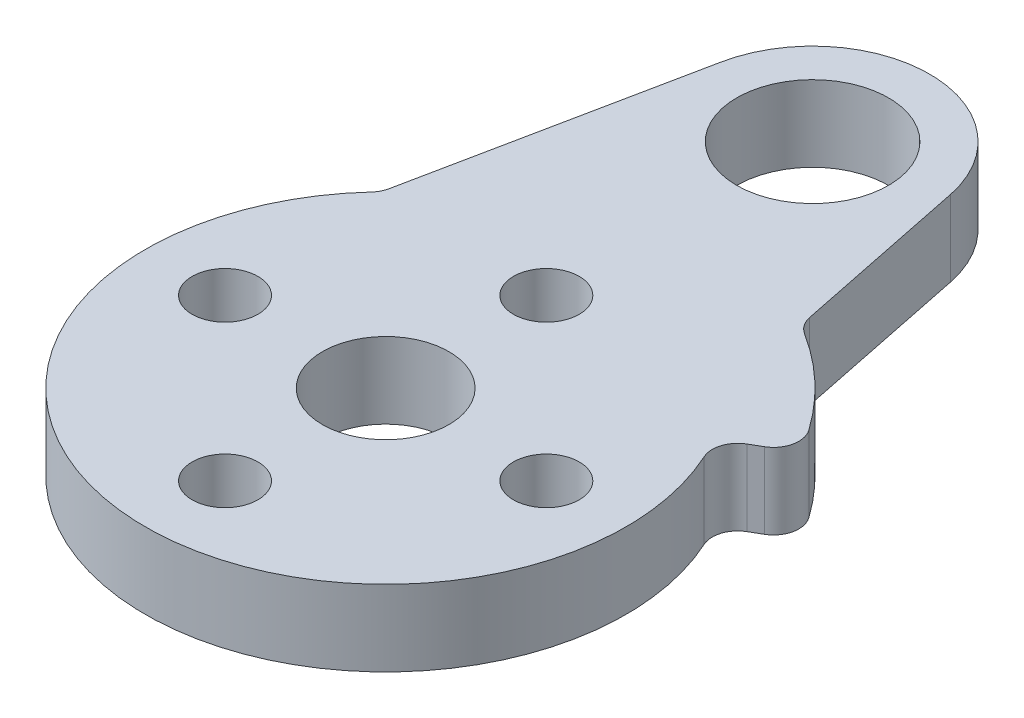
ISO-10303-21;
HEADER;
FILE_DESCRIPTION(('STEP AP214'),'2;1');
FILE_NAME('part.step','',(''),(''),'','','');
FILE_SCHEMA(('AUTOMOTIVE_DESIGN { 1 0 10303 214 1 1 1 1 }'));
ENDSEC;
DATA;
#1=APPLICATION_CONTEXT('core data for automotive mechanical design processes');
#2=APPLICATION_PROTOCOL_DEFINITION('international standard','automotive_design',2000,#1);
#3=PRODUCT_CONTEXT('',#1,'mechanical');
#4=PRODUCT('Part','Part','',(#3));
#5=PRODUCT_RELATED_PRODUCT_CATEGORY('part','',(#4));
#6=PRODUCT_DEFINITION_FORMATION('','',#4);
#7=PRODUCT_DEFINITION_CONTEXT('part definition',#1,'design');
#8=PRODUCT_DEFINITION('design','',#6,#7);
#9=PRODUCT_DEFINITION_SHAPE('','',#8);
#10=(LENGTH_UNIT() NAMED_UNIT(*) SI_UNIT(.MILLI.,.METRE.));
#11=(NAMED_UNIT(*) PLANE_ANGLE_UNIT() SI_UNIT($,.RADIAN.));
#12=(NAMED_UNIT(*) SI_UNIT($,.STERADIAN.) SOLID_ANGLE_UNIT());
#13=UNCERTAINTY_MEASURE_WITH_UNIT(LENGTH_MEASURE(1.E-05),#10,'distance_accuracy_value','');
#14=(GEOMETRIC_REPRESENTATION_CONTEXT(3) GLOBAL_UNCERTAINTY_ASSIGNED_CONTEXT((#13)) GLOBAL_UNIT_ASSIGNED_CONTEXT((#10,
#11,#12)) REPRESENTATION_CONTEXT('',''));
#15=CARTESIAN_POINT('',(0.,0.,0.));
#16=DIRECTION('',(0.,0.,1.));
#17=DIRECTION('',(1.,0.,0.));
#18=AXIS2_PLACEMENT_3D('',#15,#16,#17);
#19=CARTESIAN_POINT('',(0.,3.,-16.87456));
#20=DIRECTION('',(0.,1.,0.));
#21=DIRECTION('',(0.,0.,1.));
#22=AXIS2_PLACEMENT_3D('',#19,#20,#21);
#23=PLANE('',#22);
#24=DIRECTION('',(0.866025403784439,0.,-0.5));
#25=VECTOR('',#24,1.);
#26=CARTESIAN_POINT('',(8.22724133595217,3.,-4.75));
#27=LINE('',#26,#25);
#28=CARTESIAN_POINT('',(9.05193349511583,3.,-5.22613624009172));
#29=VERTEX_POINT('',#28);
#30=CARTESIAN_POINT('',(9.48683298050514,3.,-5.47722557505166));
#31=VERTEX_POINT('',#30);
#32=EDGE_CURVE('E192',#29,#31,#27,.T.);
#33=ORIENTED_EDGE('',*,*,#32,.T.);
#34=CARTESIAN_POINT('',(8.98683298050514,3.,-6.3432509788361));
#35=DIRECTION('',(0.,1.,0.));
#36=DIRECTION('',(0.,0.,1.));
#37=AXIS2_PLACEMENT_3D('',#34,#35,#36);
#38=CIRCLE('',#37,1.);
#39=CARTESIAN_POINT('',(9.80381779691469,3.,-6.91991015873029));
#40=VERTEX_POINT('',#39);
#41=EDGE_CURVE('E47',#31,#40,#38,.T.);
#42=ORIENTED_EDGE('',*,*,#41,.T.);
#43=CARTESIAN_POINT('',(0.,3.,0.));
#44=DIRECTION('',(0.,1.,0.));
#45=DIRECTION('',(0.,0.,1.));
#46=AXIS2_PLACEMENT_3D('',#43,#44,#45);
#47=CIRCLE('',#46,12.);
#48=CARTESIAN_POINT('',(6.40799701854467,3.,-10.1458156010408));
#49=VERTEX_POINT('',#48);
#50=EDGE_CURVE('E168',#40,#49,#47,.T.);
#51=ORIENTED_EDGE('',*,*,#50,.T.);
#52=CARTESIAN_POINT('',(6.94199677009006,3.,-10.9913002344608));
#53=DIRECTION('',(0.,1.,0.));
#54=DIRECTION('',(0.,0.,1.));
#55=AXIS2_PLACEMENT_3D('',#52,#53,#54);
#56=CIRCLE('',#55,1.);
#57=CARTESIAN_POINT('',(5.96220087297679,3.,-10.7913002344608));
#58=VERTEX_POINT('',#57);
#59=EDGE_CURVE('E164',#49,#58,#56,.F.);
#60=ORIENTED_EDGE('',*,*,#59,.T.);
#61=DIRECTION('',(-0.2,0.,-0.979795897113271));
#62=VECTOR('',#61,1.);
#63=CARTESIAN_POINT('',(4.53164224618782,3.,-17.7995776));
#64=LINE('',#63,#62);
#65=CARTESIAN_POINT('',(4.53164224618782,3.,-17.7995776));
#66=VERTEX_POINT('',#65);
#67=EDGE_CURVE('E119',#58,#66,#64,.T.);
#68=ORIENTED_EDGE('',*,*,#67,.T.);
#69=CARTESIAN_POINT('',(0.,3.,-16.87456));
#70=DIRECTION('',(0.,1.,0.));
#71=DIRECTION('',(0.,0.,1.));
#72=AXIS2_PLACEMENT_3D('',#69,#70,#71);
#73=CIRCLE('',#72,4.625088);
#74=CARTESIAN_POINT('',(-4.53164224618782,3.,-17.7995776));
#75=VERTEX_POINT('',#74);
#76=EDGE_CURVE('E120',#66,#75,#73,.T.);
#77=ORIENTED_EDGE('',*,*,#76,.T.);
#78=DIRECTION('',(-0.2,0.,0.979795897113271));
#79=VECTOR('',#78,1.);
#80=CARTESIAN_POINT('',(-4.53164224618782,3.,-17.7995776));
#81=LINE('',#80,#79);
#82=CARTESIAN_POINT('',(-6.75670179426697,3.,-6.89905651979671));
#83=VERTEX_POINT('',#82);
#84=EDGE_CURVE('E110',#75,#83,#81,.T.);
#85=ORIENTED_EDGE('',*,*,#84,.T.);
#86=CARTESIAN_POINT('',(-7.73649769138024,3.,-7.09905651979671));
#87=DIRECTION('',(0.,1.,0.));
#88=DIRECTION('',(0.,0.,1.));
#89=AXIS2_PLACEMENT_3D('',#86,#87,#88);
#90=CIRCLE('',#89,1.);
#91=CARTESIAN_POINT('',(-6.99968838743927,3.,-6.42295589886369));
#92=VERTEX_POINT('',#91);
#93=EDGE_CURVE('E158',#83,#92,#90,.F.);
#94=ORIENTED_EDGE('',*,*,#93,.T.);
#95=CARTESIAN_POINT('',(0.,3.,0.));
#96=DIRECTION('',(0.,1.,0.));
#97=DIRECTION('',(0.,0.,1.));
#98=AXIS2_PLACEMENT_3D('',#95,#96,#97);
#99=CIRCLE('',#98,9.5);
#100=CARTESIAN_POINT('',(8.64222554320004,3.,-3.9448621852304));
#101=VERTEX_POINT('',#100);
#102=EDGE_CURVE('E186',#92,#101,#99,.T.);
#103=ORIENTED_EDGE('',*,*,#102,.T.);
#104=CARTESIAN_POINT('',(9.55193349511584,3.,-4.36011083630728));
#105=DIRECTION('',(0.,1.,0.));
#106=DIRECTION('',(0.,0.,1.));
#107=AXIS2_PLACEMENT_3D('',#104,#105,#106);
#108=CIRCLE('',#107,1.);
#109=EDGE_CURVE('E40',#101,#29,#108,.F.);
#110=ORIENTED_EDGE('',*,*,#109,.T.);
#111=EDGE_LOOP('',(#33,#42,#51,#60,#68,#77,#85,#94,#103,#110));
#112=FACE_BOUND('',#111,.T.);
#113=CARTESIAN_POINT('',(0.,3.,-6.35));
#114=DIRECTION('',(0.,1.,0.));
#115=DIRECTION('',(0.,0.,1.));
#116=AXIS2_PLACEMENT_3D('',#113,#114,#115);
#117=CIRCLE('',#116,1.3);
#118=CARTESIAN_POINT('',(0.,3.,-5.05));
#119=VERTEX_POINT('',#118);
#120=EDGE_CURVE('E204',#119,#119,#117,.T.);
#121=ORIENTED_EDGE('',*,*,#120,.F.);
#122=EDGE_LOOP('',(#121));
#123=FACE_BOUND('',#122,.T.);
#124=CARTESIAN_POINT('',(6.35000000000018,3.,-1.79311378806878E-13));
#125=DIRECTION('',(0.,1.,0.));
#126=DIRECTION('',(0.,0.,1.));
#127=AXIS2_PLACEMENT_3D('',#124,#125,#126);
#128=CIRCLE('',#127,1.30000000000014);
#129=CARTESIAN_POINT('',(6.35000000000018,3.,1.29999999999996));
#130=VERTEX_POINT('',#129);
#131=EDGE_CURVE('E210',#130,#130,#128,.T.);
#132=ORIENTED_EDGE('',*,*,#131,.F.);
#133=EDGE_LOOP('',(#132));
#134=FACE_BOUND('',#133,.T.);
#135=CARTESIAN_POINT('',(3.58622757613755E-13,3.,6.35));
#136=DIRECTION('',(0.,1.,0.));
#137=DIRECTION('',(0.,0.,1.));
#138=AXIS2_PLACEMENT_3D('',#135,#136,#137);
#139=CIRCLE('',#138,1.30000000000039);
#140=CARTESIAN_POINT('',(3.58622757613755E-13,3.,7.65000000000039));
#141=VERTEX_POINT('',#140);
#142=EDGE_CURVE('E216',#141,#141,#139,.T.);
#143=ORIENTED_EDGE('',*,*,#142,.F.);
#144=EDGE_LOOP('',(#143));
#145=FACE_BOUND('',#144,.T.);
#146=CARTESIAN_POINT('',(-6.34999999999982,3.,1.80089029524336E-13));
#147=DIRECTION('',(0.,1.,0.));
#148=DIRECTION('',(0.,0.,1.));
#149=AXIS2_PLACEMENT_3D('',#146,#147,#148);
#150=CIRCLE('',#149,1.30000000000029);
#151=CARTESIAN_POINT('',(-6.34999999999982,3.,1.30000000000047));
#152=VERTEX_POINT('',#151);
#153=EDGE_CURVE('E198',#152,#152,#150,.T.);
#154=ORIENTED_EDGE('',*,*,#153,.F.);
#155=EDGE_LOOP('',(#154));
#156=FACE_BOUND('',#155,.T.);
#157=CARTESIAN_POINT('',(0.,3.,-16.87456));
#158=DIRECTION('',(0.,1.,0.));
#159=DIRECTION('',(0.,0.,1.));
#160=AXIS2_PLACEMENT_3D('',#157,#158,#159);
#161=CIRCLE('',#160,3.);
#162=CARTESIAN_POINT('',(0.,3.,-13.87456));
#163=VERTEX_POINT('',#162);
#164=EDGE_CURVE('E230',#163,#163,#161,.T.);
#165=ORIENTED_EDGE('',*,*,#164,.F.);
#166=EDGE_LOOP('',(#165));
#167=FACE_BOUND('',#166,.T.);
#168=CARTESIAN_POINT('',(0.,3.,0.));
#169=DIRECTION('',(0.,1.,0.));
#170=DIRECTION('',(0.,0.,1.));
#171=AXIS2_PLACEMENT_3D('',#168,#169,#170);
#172=CIRCLE('',#171,2.5);
#173=CARTESIAN_POINT('',(0.,3.,2.5));
#174=VERTEX_POINT('',#173);
#175=EDGE_CURVE('E224',#174,#174,#172,.T.);
#176=ORIENTED_EDGE('',*,*,#175,.F.);
#177=EDGE_LOOP('',(#176));
#178=FACE_BOUND('',#177,.T.);
#179=ADVANCED_FACE('F32',(#112,#123,#134,#145,#156,#167,#178),#23,.T.);
#180=CARTESIAN_POINT('',(0.,0.,-16.87456));
#181=DIRECTION('',(0.,1.,0.));
#182=DIRECTION('',(0.,0.,1.));
#183=AXIS2_PLACEMENT_3D('',#180,#181,#182);
#184=PLANE('',#183);
#185=CARTESIAN_POINT('',(0.,0.,0.));
#186=DIRECTION('',(0.,1.,0.));
#187=DIRECTION('',(0.,0.,1.));
#188=AXIS2_PLACEMENT_3D('',#185,#186,#187);
#189=CIRCLE('',#188,12.);
#190=CARTESIAN_POINT('',(6.40799701854467,0.,-10.1458156010408));
#191=VERTEX_POINT('',#190);
#192=CARTESIAN_POINT('',(9.80381779691469,0.,-6.91991015873029));
#193=VERTEX_POINT('',#192);
#194=EDGE_CURVE('E182',#191,#193,#189,.F.);
#195=ORIENTED_EDGE('',*,*,#194,.T.);
#196=CARTESIAN_POINT('',(8.98683298050514,0.,-6.3432509788361));
#197=DIRECTION('',(0.,1.,0.));
#198=DIRECTION('',(0.,0.,1.));
#199=AXIS2_PLACEMENT_3D('',#196,#197,#198);
#200=CIRCLE('',#199,1.);
#201=CARTESIAN_POINT('',(9.48683298050514,0.,-5.47722557505166));
#202=VERTEX_POINT('',#201);
#203=EDGE_CURVE('E156',#193,#202,#200,.F.);
#204=ORIENTED_EDGE('',*,*,#203,.T.);
#205=DIRECTION('',(-0.866025403784439,0.,0.5));
#206=VECTOR('',#205,1.);
#207=CARTESIAN_POINT('',(8.22724133595217,0.,-4.75));
#208=LINE('',#207,#206);
#209=CARTESIAN_POINT('',(9.05193349511583,0.,-5.22613624009172));
#210=VERTEX_POINT('',#209);
#211=EDGE_CURVE('E187',#202,#210,#208,.T.);
#212=ORIENTED_EDGE('',*,*,#211,.T.);
#213=CARTESIAN_POINT('',(9.55193349511584,0.,-4.36011083630728));
#214=DIRECTION('',(0.,1.,0.));
#215=DIRECTION('',(0.,0.,1.));
#216=AXIS2_PLACEMENT_3D('',#213,#214,#215);
#217=CIRCLE('',#216,1.);
#218=CARTESIAN_POINT('',(8.64222554320004,0.,-3.9448621852304));
#219=VERTEX_POINT('',#218);
#220=EDGE_CURVE('E11',#210,#219,#217,.T.);
#221=ORIENTED_EDGE('',*,*,#220,.T.);
#222=CARTESIAN_POINT('',(0.,0.,0.));
#223=DIRECTION('',(0.,1.,0.));
#224=DIRECTION('',(0.,0.,1.));
#225=AXIS2_PLACEMENT_3D('',#222,#223,#224);
#226=CIRCLE('',#225,9.5);
#227=CARTESIAN_POINT('',(-6.99968838743927,0.,-6.42295589886369));
#228=VERTEX_POINT('',#227);
#229=EDGE_CURVE('E189',#228,#219,#226,.T.);
#230=ORIENTED_EDGE('',*,*,#229,.F.);
#231=CARTESIAN_POINT('',(-7.73649769138024,0.,-7.09905651979671));
#232=DIRECTION('',(0.,1.,0.));
#233=DIRECTION('',(0.,0.,1.));
#234=AXIS2_PLACEMENT_3D('',#231,#232,#233);
#235=CIRCLE('',#234,1.);
#236=CARTESIAN_POINT('',(-6.75670179426697,0.,-6.89905651979671));
#237=VERTEX_POINT('',#236);
#238=EDGE_CURVE('E160',#228,#237,#235,.T.);
#239=ORIENTED_EDGE('',*,*,#238,.T.);
#240=DIRECTION('',(-0.2,0.,0.979795897113271));
#241=VECTOR('',#240,1.);
#242=CARTESIAN_POINT('',(-4.53164224618782,0.,-17.7995776));
#243=LINE('',#242,#241);
#244=CARTESIAN_POINT('',(-4.53164224618782,0.,-17.7995776));
#245=VERTEX_POINT('',#244);
#246=EDGE_CURVE('E236',#245,#237,#243,.T.);
#247=ORIENTED_EDGE('',*,*,#246,.F.);
#248=CARTESIAN_POINT('',(0.,0.,-16.87456));
#249=DIRECTION('',(0.,1.,0.));
#250=DIRECTION('',(0.,0.,1.));
#251=AXIS2_PLACEMENT_3D('',#248,#249,#250);
#252=CIRCLE('',#251,4.625088);
#253=CARTESIAN_POINT('',(4.53164224618782,0.,-17.7995776));
#254=VERTEX_POINT('',#253);
#255=EDGE_CURVE('E132',#254,#245,#252,.T.);
#256=ORIENTED_EDGE('',*,*,#255,.F.);
#257=DIRECTION('',(-0.2,0.,-0.979795897113271));
#258=VECTOR('',#257,1.);
#259=CARTESIAN_POINT('',(4.53164224618782,0.,-17.7995776));
#260=LINE('',#259,#258);
#261=CARTESIAN_POINT('',(5.96220087297679,0.,-10.7913002344608));
#262=VERTEX_POINT('',#261);
#263=EDGE_CURVE('E128',#262,#254,#260,.T.);
#264=ORIENTED_EDGE('',*,*,#263,.F.);
#265=CARTESIAN_POINT('',(6.94199677009006,0.,-10.9913002344608));
#266=DIRECTION('',(0.,1.,0.));
#267=DIRECTION('',(0.,0.,1.));
#268=AXIS2_PLACEMENT_3D('',#265,#266,#267);
#269=CIRCLE('',#268,1.);
#270=EDGE_CURVE('E162',#262,#191,#269,.T.);
#271=ORIENTED_EDGE('',*,*,#270,.T.);
#272=EDGE_LOOP('',(#195,#204,#212,#221,#230,#239,#247,#256,#264,#271));
#273=FACE_BOUND('',#272,.T.);
#274=CARTESIAN_POINT('',(0.,0.,-6.35));
#275=DIRECTION('',(0.,1.,0.));
#276=DIRECTION('',(0.,0.,1.));
#277=AXIS2_PLACEMENT_3D('',#274,#275,#276);
#278=CIRCLE('',#277,1.3);
#279=CARTESIAN_POINT('',(0.,0.,-5.05));
#280=VERTEX_POINT('',#279);
#281=EDGE_CURVE('E200',#280,#280,#278,.T.);
#282=ORIENTED_EDGE('',*,*,#281,.T.);
#283=EDGE_LOOP('',(#282));
#284=FACE_BOUND('',#283,.T.);
#285=CARTESIAN_POINT('',(6.35000000000018,0.,-1.79311378806878E-13));
#286=DIRECTION('',(0.,1.,0.));
#287=DIRECTION('',(0.,0.,1.));
#288=AXIS2_PLACEMENT_3D('',#285,#286,#287);
#289=CIRCLE('',#288,1.30000000000014);
#290=CARTESIAN_POINT('',(6.35000000000018,0.,1.29999999999996));
#291=VERTEX_POINT('',#290);
#292=EDGE_CURVE('E207',#291,#291,#289,.T.);
#293=ORIENTED_EDGE('',*,*,#292,.T.);
#294=EDGE_LOOP('',(#293));
#295=FACE_BOUND('',#294,.T.);
#296=CARTESIAN_POINT('',(3.58622757613755E-13,0.,6.35));
#297=DIRECTION('',(0.,1.,0.));
#298=DIRECTION('',(0.,0.,1.));
#299=AXIS2_PLACEMENT_3D('',#296,#297,#298);
#300=CIRCLE('',#299,1.30000000000039);
#301=CARTESIAN_POINT('',(3.58622757613755E-13,0.,7.65000000000039));
#302=VERTEX_POINT('',#301);
#303=EDGE_CURVE('E213',#302,#302,#300,.T.);
#304=ORIENTED_EDGE('',*,*,#303,.T.);
#305=EDGE_LOOP('',(#304));
#306=FACE_BOUND('',#305,.T.);
#307=CARTESIAN_POINT('',(-6.34999999999982,0.,1.80089029524336E-13));
#308=DIRECTION('',(0.,1.,0.));
#309=DIRECTION('',(0.,0.,1.));
#310=AXIS2_PLACEMENT_3D('',#307,#308,#309);
#311=CIRCLE('',#310,1.30000000000029);
#312=CARTESIAN_POINT('',(-6.34999999999982,0.,1.30000000000047));
#313=VERTEX_POINT('',#312);
#314=EDGE_CURVE('E219',#313,#313,#311,.T.);
#315=ORIENTED_EDGE('',*,*,#314,.T.);
#316=EDGE_LOOP('',(#315));
#317=FACE_BOUND('',#316,.T.);
#318=CARTESIAN_POINT('',(0.,0.,-16.87456));
#319=DIRECTION('',(0.,1.,0.));
#320=DIRECTION('',(0.,0.,1.));
#321=AXIS2_PLACEMENT_3D('',#318,#319,#320);
#322=CIRCLE('',#321,3.);
#323=CARTESIAN_POINT('',(0.,0.,-13.87456));
#324=VERTEX_POINT('',#323);
#325=EDGE_CURVE('E227',#324,#324,#322,.T.);
#326=ORIENTED_EDGE('',*,*,#325,.T.);
#327=EDGE_LOOP('',(#326));
#328=FACE_BOUND('',#327,.T.);
#329=CARTESIAN_POINT('',(0.,0.,0.));
#330=DIRECTION('',(0.,1.,0.));
#331=DIRECTION('',(0.,0.,1.));
#332=AXIS2_PLACEMENT_3D('',#329,#330,#331);
#333=CIRCLE('',#332,2.5);
#334=CARTESIAN_POINT('',(0.,0.,2.5));
#335=VERTEX_POINT('',#334);
#336=EDGE_CURVE('E203',#335,#335,#333,.T.);
#337=ORIENTED_EDGE('',*,*,#336,.T.);
#338=EDGE_LOOP('',(#337));
#339=FACE_BOUND('',#338,.T.);
#340=ADVANCED_FACE('F180',(#273,#284,#295,#306,#317,#328,#339),#184,.F.);
#341=CARTESIAN_POINT('',(0.,3.,-16.87456));
#342=DIRECTION('',(0.,-1.,0.));
#343=DIRECTION('',(0.,0.,-1.));
#344=AXIS2_PLACEMENT_3D('',#341,#342,#343);
#345=CYLINDRICAL_SURFACE('',#344,4.625088);
#346=ORIENTED_EDGE('',*,*,#255,.T.);
#347=DIRECTION('',(0.,-1.,0.));
#348=VECTOR('',#347,1.);
#349=CARTESIAN_POINT('',(-4.53164224618782,3.,-17.7995776));
#350=LINE('',#349,#348);
#351=EDGE_CURVE('E115',#75,#245,#350,.T.);
#352=ORIENTED_EDGE('',*,*,#351,.F.);
#353=ORIENTED_EDGE('',*,*,#76,.F.);
#354=DIRECTION('',(0.,-1.,0.));
#355=VECTOR('',#354,1.);
#356=CARTESIAN_POINT('',(4.53164224618782,3.,-17.7995776));
#357=LINE('',#356,#355);
#358=EDGE_CURVE('E133',#66,#254,#357,.T.);
#359=ORIENTED_EDGE('',*,*,#358,.T.);
#360=EDGE_LOOP('',(#346,#352,#353,#359));
#361=FACE_BOUND('',#360,.T.);
#362=ADVANCED_FACE('F130',(#361),#345,.T.);
#363=CARTESIAN_POINT('',(-4.53164224618782,3.,-17.7995776));
#364=DIRECTION('',(0.979795897113271,0.,0.2));
#365=DIRECTION('',(0.2,0.,-0.979795897113271));
#366=AXIS2_PLACEMENT_3D('',#363,#364,#365);
#367=PLANE('',#366);
#368=ORIENTED_EDGE('',*,*,#246,.T.);
#369=DIRECTION('',(0.,1.,0.));
#370=VECTOR('',#369,1.);
#371=CARTESIAN_POINT('',(-6.75670179426697,3.,-6.89905651979671));
#372=LINE('',#371,#370);
#373=EDGE_CURVE('E118',#237,#83,#372,.T.);
#374=ORIENTED_EDGE('',*,*,#373,.T.);
#375=ORIENTED_EDGE('',*,*,#84,.F.);
#376=ORIENTED_EDGE('',*,*,#351,.T.);
#377=EDGE_LOOP('',(#368,#374,#375,#376));
#378=FACE_BOUND('',#377,.T.);
#379=ADVANCED_FACE('F113',(#378),#367,.F.);
#380=CARTESIAN_POINT('',(4.53164224618782,3.,-17.7995776));
#381=DIRECTION('',(-0.979795897113271,0.,0.2));
#382=DIRECTION('',(0.2,0.,0.979795897113271));
#383=AXIS2_PLACEMENT_3D('',#380,#381,#382);
#384=PLANE('',#383);
#385=ORIENTED_EDGE('',*,*,#67,.F.);
#386=DIRECTION('',(0.,1.,0.));
#387=VECTOR('',#386,1.);
#388=CARTESIAN_POINT('',(5.96220087297679,3.,-10.7913002344608));
#389=LINE('',#388,#387);
#390=EDGE_CURVE('E144',#58,#262,#389,.F.);
#391=ORIENTED_EDGE('',*,*,#390,.T.);
#392=ORIENTED_EDGE('',*,*,#263,.T.);
#393=ORIENTED_EDGE('',*,*,#358,.F.);
#394=EDGE_LOOP('',(#385,#391,#392,#393));
#395=FACE_BOUND('',#394,.T.);
#396=ADVANCED_FACE('F173',(#395),#384,.F.);
#397=CARTESIAN_POINT('',(0.,3.,-16.87456));
#398=DIRECTION('',(0.,-1.,0.));
#399=DIRECTION('',(0.,0.,-1.));
#400=AXIS2_PLACEMENT_3D('',#397,#398,#399);
#401=CYLINDRICAL_SURFACE('',#400,3.);
#402=ORIENTED_EDGE('',*,*,#164,.T.);
#403=EDGE_LOOP('',(#402));
#404=FACE_BOUND('',#403,.T.);
#405=ORIENTED_EDGE('',*,*,#325,.F.);
#406=EDGE_LOOP('',(#405));
#407=FACE_BOUND('',#406,.T.);
#408=ADVANCED_FACE('F264',(#404,#407),#401,.F.);
#409=CARTESIAN_POINT('',(0.,3.,0.));
#410=DIRECTION('',(0.,-1.,0.));
#411=DIRECTION('',(0.,0.,-1.));
#412=AXIS2_PLACEMENT_3D('',#409,#410,#411);
#413=CYLINDRICAL_SURFACE('',#412,2.5);
#414=ORIENTED_EDGE('',*,*,#175,.T.);
#415=EDGE_LOOP('',(#414));
#416=FACE_BOUND('',#415,.T.);
#417=ORIENTED_EDGE('',*,*,#336,.F.);
#418=EDGE_LOOP('',(#417));
#419=FACE_BOUND('',#418,.T.);
#420=ADVANCED_FACE('F365',(#416,#419),#413,.F.);
#421=CARTESIAN_POINT('',(-6.34999999999982,0.,1.80089029524336E-13));
#422=DIRECTION('',(0.,1.,0.));
#423=DIRECTION('',(0.,0.,1.));
#424=AXIS2_PLACEMENT_3D('',#421,#422,#423);
#425=CYLINDRICAL_SURFACE('',#424,1.30000000000029);
#426=ORIENTED_EDGE('',*,*,#314,.F.);
#427=EDGE_LOOP('',(#426));
#428=FACE_BOUND('',#427,.T.);
#429=ORIENTED_EDGE('',*,*,#153,.T.);
#430=EDGE_LOOP('',(#429));
#431=FACE_BOUND('',#430,.T.);
#432=ADVANCED_FACE('F374',(#428,#431),#425,.F.);
#433=CARTESIAN_POINT('',(3.58622757613755E-13,0.,6.35));
#434=DIRECTION('',(0.,1.,0.));
#435=DIRECTION('',(0.,0.,1.));
#436=AXIS2_PLACEMENT_3D('',#433,#434,#435);
#437=CYLINDRICAL_SURFACE('',#436,1.30000000000039);
#438=ORIENTED_EDGE('',*,*,#303,.F.);
#439=EDGE_LOOP('',(#438));
#440=FACE_BOUND('',#439,.T.);
#441=ORIENTED_EDGE('',*,*,#142,.T.);
#442=EDGE_LOOP('',(#441));
#443=FACE_BOUND('',#442,.T.);
#444=ADVANCED_FACE('F383',(#440,#443),#437,.F.);
#445=CARTESIAN_POINT('',(6.35000000000018,0.,-1.79311378806878E-13));
#446=DIRECTION('',(0.,1.,0.));
#447=DIRECTION('',(0.,0.,1.));
#448=AXIS2_PLACEMENT_3D('',#445,#446,#447);
#449=CYLINDRICAL_SURFACE('',#448,1.30000000000014);
#450=ORIENTED_EDGE('',*,*,#292,.F.);
#451=EDGE_LOOP('',(#450));
#452=FACE_BOUND('',#451,.T.);
#453=ORIENTED_EDGE('',*,*,#131,.T.);
#454=EDGE_LOOP('',(#453));
#455=FACE_BOUND('',#454,.T.);
#456=ADVANCED_FACE('F393',(#452,#455),#449,.F.);
#457=CARTESIAN_POINT('',(0.,0.,-6.35));
#458=DIRECTION('',(0.,1.,0.));
#459=DIRECTION('',(0.,0.,1.));
#460=AXIS2_PLACEMENT_3D('',#457,#458,#459);
#461=CYLINDRICAL_SURFACE('',#460,1.3);
#462=ORIENTED_EDGE('',*,*,#281,.F.);
#463=EDGE_LOOP('',(#462));
#464=FACE_BOUND('',#463,.T.);
#465=ORIENTED_EDGE('',*,*,#120,.T.);
#466=EDGE_LOOP('',(#465));
#467=FACE_BOUND('',#466,.T.);
#468=ADVANCED_FACE('F337',(#464,#467),#461,.F.);
#469=CARTESIAN_POINT('',(0.,0.,0.));
#470=DIRECTION('',(0.,1.,0.));
#471=DIRECTION('',(0.,0.,1.));
#472=AXIS2_PLACEMENT_3D('',#469,#470,#471);
#473=CYLINDRICAL_SURFACE('',#472,9.5);
#474=ORIENTED_EDGE('',*,*,#102,.F.);
#475=DIRECTION('',(0.,1.,0.));
#476=VECTOR('',#475,1.);
#477=CARTESIAN_POINT('',(-6.99968838743927,0.,-6.42295589886369));
#478=LINE('',#477,#476);
#479=EDGE_CURVE('E142',#92,#228,#478,.F.);
#480=ORIENTED_EDGE('',*,*,#479,.T.);
#481=ORIENTED_EDGE('',*,*,#229,.T.);
#482=DIRECTION('',(0.,1.,0.));
#483=VECTOR('',#482,1.);
#484=CARTESIAN_POINT('',(8.64222554320004,0.,-3.9448621852304));
#485=LINE('',#484,#483);
#486=EDGE_CURVE('E135',#219,#101,#485,.T.);
#487=ORIENTED_EDGE('',*,*,#486,.T.);
#488=EDGE_LOOP('',(#474,#480,#481,#487));
#489=FACE_BOUND('',#488,.T.);
#490=ADVANCED_FACE('F244',(#489),#473,.T.);
#491=CARTESIAN_POINT('',(0.,-12.6713258974742,0.));
#492=DIRECTION('',(0.,1.,0.));
#493=DIRECTION('',(0.,0.,1.));
#494=AXIS2_PLACEMENT_3D('',#491,#492,#493);
#495=CYLINDRICAL_SURFACE('',#494,12.);
#496=ORIENTED_EDGE('',*,*,#194,.F.);
#497=DIRECTION('',(0.,1.,0.));
#498=VECTOR('',#497,1.);
#499=CARTESIAN_POINT('',(6.40799701854468,-12.6713258974742,-10.1458156010408));
#500=LINE('',#499,#498);
#501=EDGE_CURVE('E149',#191,#49,#500,.T.);
#502=ORIENTED_EDGE('',*,*,#501,.T.);
#503=ORIENTED_EDGE('',*,*,#50,.F.);
#504=DIRECTION('',(0.,1.,0.));
#505=VECTOR('',#504,1.);
#506=CARTESIAN_POINT('',(9.8038177969147,-12.6713258974742,-6.91991015873029));
#507=LINE('',#506,#505);
#508=EDGE_CURVE('E147',#40,#193,#507,.F.);
#509=ORIENTED_EDGE('',*,*,#508,.T.);
#510=EDGE_LOOP('',(#496,#502,#503,#509));
#511=FACE_BOUND('',#510,.T.);
#512=ADVANCED_FACE('F185',(#511),#495,.T.);
#513=CARTESIAN_POINT('',(8.22724133595217,-12.6713258974742,-4.75));
#514=DIRECTION('',(0.5,0.,0.866025403784439));
#515=DIRECTION('',(0.866025403784439,0.,-0.5));
#516=AXIS2_PLACEMENT_3D('',#513,#514,#515);
#517=PLANE('',#516);
#518=ORIENTED_EDGE('',*,*,#32,.F.);
#519=DIRECTION('',(0.,-1.,0.));
#520=VECTOR('',#519,1.);
#521=CARTESIAN_POINT('',(9.05193349511583,0.,-5.22613624009172));
#522=LINE('',#521,#520);
#523=EDGE_CURVE('E153',#29,#210,#522,.T.);
#524=ORIENTED_EDGE('',*,*,#523,.T.);
#525=ORIENTED_EDGE('',*,*,#211,.F.);
#526=DIRECTION('',(0.,1.,0.));
#527=VECTOR('',#526,1.);
#528=CARTESIAN_POINT('',(9.48683298050514,-12.6713258974742,-5.47722557505166));
#529=LINE('',#528,#527);
#530=EDGE_CURVE('E151',#202,#31,#529,.T.);
#531=ORIENTED_EDGE('',*,*,#530,.T.);
#532=EDGE_LOOP('',(#518,#524,#525,#531));
#533=FACE_BOUND('',#532,.T.);
#534=ADVANCED_FACE('F252',(#533),#517,.T.);
#535=CARTESIAN_POINT('',(-7.73649769138024,0.,-7.09905651979671));
#536=DIRECTION('',(0.,1.,0.));
#537=DIRECTION('',(0.,0.,1.));
#538=AXIS2_PLACEMENT_3D('',#535,#536,#537);
#539=CYLINDRICAL_SURFACE('',#538,1.);
#540=ORIENTED_EDGE('',*,*,#238,.F.);
#541=ORIENTED_EDGE('',*,*,#479,.F.);
#542=ORIENTED_EDGE('',*,*,#93,.F.);
#543=ORIENTED_EDGE('',*,*,#373,.F.);
#544=EDGE_LOOP('',(#540,#541,#542,#543));
#545=FACE_BOUND('',#544,.T.);
#546=ADVANCED_FACE('F240',(#545),#539,.F.);
#547=CARTESIAN_POINT('',(6.94199677009006,-12.6713258974742,-10.9913002344608));
#548=DIRECTION('',(0.,1.,0.));
#549=DIRECTION('',(0.,0.,1.));
#550=AXIS2_PLACEMENT_3D('',#547,#548,#549);
#551=CYLINDRICAL_SURFACE('',#550,1.);
#552=ORIENTED_EDGE('',*,*,#59,.F.);
#553=ORIENTED_EDGE('',*,*,#501,.F.);
#554=ORIENTED_EDGE('',*,*,#270,.F.);
#555=ORIENTED_EDGE('',*,*,#390,.F.);
#556=EDGE_LOOP('',(#552,#553,#554,#555));
#557=FACE_BOUND('',#556,.T.);
#558=ADVANCED_FACE('F176',(#557),#551,.F.);
#559=CARTESIAN_POINT('',(9.55193349511584,0.,-4.36011083630728));
#560=DIRECTION('',(0.,1.,0.));
#561=DIRECTION('',(0.,0.,1.));
#562=AXIS2_PLACEMENT_3D('',#559,#560,#561);
#563=CYLINDRICAL_SURFACE('',#562,1.);
#564=ORIENTED_EDGE('',*,*,#220,.F.);
#565=ORIENTED_EDGE('',*,*,#523,.F.);
#566=ORIENTED_EDGE('',*,*,#109,.F.);
#567=ORIENTED_EDGE('',*,*,#486,.F.);
#568=EDGE_LOOP('',(#564,#565,#566,#567));
#569=FACE_BOUND('',#568,.T.);
#570=ADVANCED_FACE('F248',(#569),#563,.F.);
#571=CARTESIAN_POINT('',(8.98683298050514,-12.6713258974742,-6.3432509788361));
#572=DIRECTION('',(0.,1.,0.));
#573=DIRECTION('',(0.,0.,1.));
#574=AXIS2_PLACEMENT_3D('',#571,#572,#573);
#575=CYLINDRICAL_SURFACE('',#574,1.);
#576=ORIENTED_EDGE('',*,*,#203,.F.);
#577=ORIENTED_EDGE('',*,*,#508,.F.);
#578=ORIENTED_EDGE('',*,*,#41,.F.);
#579=ORIENTED_EDGE('',*,*,#530,.F.);
#580=EDGE_LOOP('',(#576,#577,#578,#579));
#581=FACE_BOUND('',#580,.T.);
#582=ADVANCED_FACE('F34',(#581),#575,.T.);
#583=CLOSED_SHELL('',(#179,#340,#362,#379,#396,#408,#420,#432,#444,#456,#468,#490,#512,#534,
#546,#558,#570,#582));
#584=MANIFOLD_SOLID_BREP('B2',#583);
#585=ADVANCED_BREP_SHAPE_REPRESENTATION('',(#18,#584),#14);
#586=SHAPE_DEFINITION_REPRESENTATION(#9,#585);
ENDSEC;
END-ISO-10303-21;
